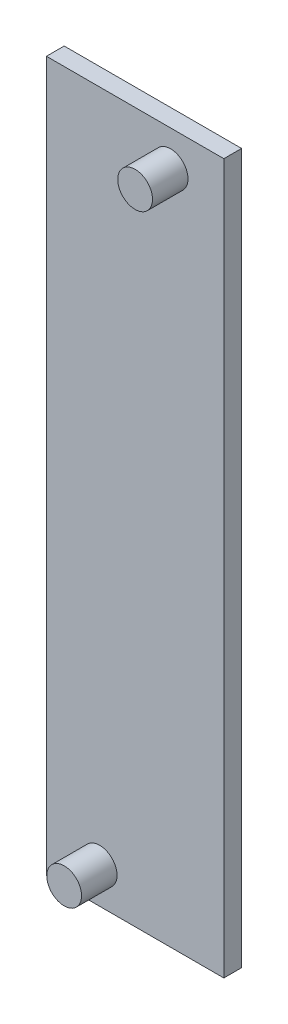
ISO-10303-21;
HEADER;
FILE_DESCRIPTION(('STEP AP214'),'2;1');
FILE_NAME('part.step','',(''),(''),'','','');
FILE_SCHEMA(('AUTOMOTIVE_DESIGN { 1 0 10303 214 1 1 1 1 }'));
ENDSEC;
DATA;
#1=APPLICATION_CONTEXT('core data for automotive mechanical design processes');
#2=APPLICATION_PROTOCOL_DEFINITION('international standard','automotive_design',2000,#1);
#3=PRODUCT_CONTEXT('',#1,'mechanical');
#4=PRODUCT('Part','Part','',(#3));
#5=PRODUCT_RELATED_PRODUCT_CATEGORY('part','',(#4));
#6=PRODUCT_DEFINITION_FORMATION('','',#4);
#7=PRODUCT_DEFINITION_CONTEXT('part definition',#1,'design');
#8=PRODUCT_DEFINITION('design','',#6,#7);
#9=PRODUCT_DEFINITION_SHAPE('','',#8);
#10=(LENGTH_UNIT() NAMED_UNIT(*) SI_UNIT(.MILLI.,.METRE.));
#11=(NAMED_UNIT(*) PLANE_ANGLE_UNIT() SI_UNIT($,.RADIAN.));
#12=(NAMED_UNIT(*) SI_UNIT($,.STERADIAN.) SOLID_ANGLE_UNIT());
#13=UNCERTAINTY_MEASURE_WITH_UNIT(LENGTH_MEASURE(1.E-05),#10,'distance_accuracy_value','');
#14=(GEOMETRIC_REPRESENTATION_CONTEXT(3) GLOBAL_UNCERTAINTY_ASSIGNED_CONTEXT((#13)) GLOBAL_UNIT_ASSIGNED_CONTEXT((#10,
#11,#12)) REPRESENTATION_CONTEXT('',''));
#15=CARTESIAN_POINT('',(0.,0.,0.));
#16=DIRECTION('',(0.,0.,1.));
#17=DIRECTION('',(1.,0.,0.));
#18=AXIS2_PLACEMENT_3D('',#15,#16,#17);
#19=CARTESIAN_POINT('',(0.,0.,5.));
#20=DIRECTION('',(1.,0.,0.));
#21=DIRECTION('',(0.,1.,0.));
#22=AXIS2_PLACEMENT_3D('',#19,#20,#21);
#23=PLANE('',#22);
#24=DIRECTION('',(0.,-1.,0.));
#25=VECTOR('',#24,1.);
#26=CARTESIAN_POINT('',(0.,0.,0.));
#27=LINE('',#26,#25);
#28=CARTESIAN_POINT('',(0.,200.,0.));
#29=VERTEX_POINT('',#28);
#30=CARTESIAN_POINT('',(0.,0.,0.));
#31=VERTEX_POINT('',#30);
#32=EDGE_CURVE('E99',#29,#31,#27,.T.);
#33=ORIENTED_EDGE('',*,*,#32,.T.);
#34=DIRECTION('',(0.,0.,-1.));
#35=VECTOR('',#34,1.);
#36=CARTESIAN_POINT('',(0.,0.,5.));
#37=LINE('',#36,#35);
#38=CARTESIAN_POINT('',(0.,0.,5.));
#39=VERTEX_POINT('',#38);
#40=EDGE_CURVE('E90',#39,#31,#37,.T.);
#41=ORIENTED_EDGE('',*,*,#40,.F.);
#42=DIRECTION('',(0.,-1.,0.));
#43=VECTOR('',#42,1.);
#44=CARTESIAN_POINT('',(0.,0.,5.));
#45=LINE('',#44,#43);
#46=CARTESIAN_POINT('',(0.,200.,5.));
#47=VERTEX_POINT('',#46);
#48=EDGE_CURVE('E84',#47,#39,#45,.T.);
#49=ORIENTED_EDGE('',*,*,#48,.F.);
#50=DIRECTION('',(0.,0.,-1.));
#51=VECTOR('',#50,1.);
#52=CARTESIAN_POINT('',(0.,200.,5.));
#53=LINE('',#52,#51);
#54=EDGE_CURVE('E95',#47,#29,#53,.T.);
#55=ORIENTED_EDGE('',*,*,#54,.T.);
#56=EDGE_LOOP('',(#33,#41,#49,#55));
#57=FACE_BOUND('',#56,.T.);
#58=ADVANCED_FACE('F32',(#57),#23,.F.);
#59=CARTESIAN_POINT('',(0.,0.,5.));
#60=DIRECTION('',(0.,1.,0.));
#61=DIRECTION('',(0.,0.,1.));
#62=AXIS2_PLACEMENT_3D('',#59,#60,#61);
#63=PLANE('',#62);
#64=DIRECTION('',(1.,0.,0.));
#65=VECTOR('',#64,1.);
#66=CARTESIAN_POINT('',(0.,0.,0.));
#67=LINE('',#66,#65);
#68=CARTESIAN_POINT('',(50.,0.,0.));
#69=VERTEX_POINT('',#68);
#70=EDGE_CURVE('E89',#31,#69,#67,.T.);
#71=ORIENTED_EDGE('',*,*,#70,.T.);
#72=DIRECTION('',(0.,0.,-1.));
#73=VECTOR('',#72,1.);
#74=CARTESIAN_POINT('',(50.,0.,5.));
#75=LINE('',#74,#73);
#76=CARTESIAN_POINT('',(50.,0.,5.));
#77=VERTEX_POINT('',#76);
#78=EDGE_CURVE('E87',#77,#69,#75,.T.);
#79=ORIENTED_EDGE('',*,*,#78,.F.);
#80=DIRECTION('',(1.,0.,0.));
#81=VECTOR('',#80,1.);
#82=CARTESIAN_POINT('',(0.,0.,5.));
#83=LINE('',#82,#81);
#84=EDGE_CURVE('E79',#39,#77,#83,.T.);
#85=ORIENTED_EDGE('',*,*,#84,.F.);
#86=ORIENTED_EDGE('',*,*,#40,.T.);
#87=EDGE_LOOP('',(#71,#79,#85,#86));
#88=FACE_BOUND('',#87,.T.);
#89=ADVANCED_FACE('F88',(#88),#63,.F.);
#90=CARTESIAN_POINT('',(50.,0.,5.));
#91=DIRECTION('',(-1.,0.,0.));
#92=DIRECTION('',(0.,-1.,0.));
#93=AXIS2_PLACEMENT_3D('',#90,#91,#92);
#94=PLANE('',#93);
#95=DIRECTION('',(0.,1.,0.));
#96=VECTOR('',#95,1.);
#97=CARTESIAN_POINT('',(50.,0.,0.));
#98=LINE('',#97,#96);
#99=CARTESIAN_POINT('',(50.,200.,0.));
#100=VERTEX_POINT('',#99);
#101=EDGE_CURVE('E65',#69,#100,#98,.T.);
#102=ORIENTED_EDGE('',*,*,#101,.T.);
#103=DIRECTION('',(0.,0.,-1.));
#104=VECTOR('',#103,1.);
#105=CARTESIAN_POINT('',(50.,200.,5.));
#106=LINE('',#105,#104);
#107=CARTESIAN_POINT('',(50.,200.,5.));
#108=VERTEX_POINT('',#107);
#109=EDGE_CURVE('E91',#108,#100,#106,.T.);
#110=ORIENTED_EDGE('',*,*,#109,.F.);
#111=DIRECTION('',(0.,1.,0.));
#112=VECTOR('',#111,1.);
#113=CARTESIAN_POINT('',(50.,0.,5.));
#114=LINE('',#113,#112);
#115=EDGE_CURVE('E82',#77,#108,#114,.T.);
#116=ORIENTED_EDGE('',*,*,#115,.F.);
#117=ORIENTED_EDGE('',*,*,#78,.T.);
#118=EDGE_LOOP('',(#102,#110,#116,#117));
#119=FACE_BOUND('',#118,.T.);
#120=ADVANCED_FACE('F93',(#119),#94,.F.);
#121=CARTESIAN_POINT('',(0.,200.,5.));
#122=DIRECTION('',(0.,-1.,0.));
#123=DIRECTION('',(0.,0.,-1.));
#124=AXIS2_PLACEMENT_3D('',#121,#122,#123);
#125=PLANE('',#124);
#126=DIRECTION('',(-1.,0.,0.));
#127=VECTOR('',#126,1.);
#128=CARTESIAN_POINT('',(0.,200.,0.));
#129=LINE('',#128,#127);
#130=EDGE_CURVE('E71',#100,#29,#129,.T.);
#131=ORIENTED_EDGE('',*,*,#130,.T.);
#132=ORIENTED_EDGE('',*,*,#54,.F.);
#133=DIRECTION('',(-1.,0.,0.));
#134=VECTOR('',#133,1.);
#135=CARTESIAN_POINT('',(0.,200.,5.));
#136=LINE('',#135,#134);
#137=EDGE_CURVE('E48',#108,#47,#136,.T.);
#138=ORIENTED_EDGE('',*,*,#137,.F.);
#139=ORIENTED_EDGE('',*,*,#109,.T.);
#140=EDGE_LOOP('',(#131,#132,#138,#139));
#141=FACE_BOUND('',#140,.T.);
#142=ADVANCED_FACE('F115',(#141),#125,.F.);
#143=CARTESIAN_POINT('',(0.,0.,5.));
#144=DIRECTION('',(0.,0.,-1.));
#145=DIRECTION('',(-1.,0.,0.));
#146=AXIS2_PLACEMENT_3D('',#143,#144,#145);
#147=PLANE('',#146);
#148=CARTESIAN_POINT('',(35.,190.,5.));
#149=DIRECTION('',(0.,0.,-1.));
#150=DIRECTION('',(-1.,0.,0.));
#151=AXIS2_PLACEMENT_3D('',#148,#149,#150);
#152=CIRCLE('',#151,4.89999999999998);
#153=CARTESIAN_POINT('',(30.1,190.,5.));
#154=VERTEX_POINT('',#153);
#155=EDGE_CURVE('E11',#154,#154,#152,.F.);
#156=ORIENTED_EDGE('',*,*,#155,.F.);
#157=EDGE_LOOP('',(#156));
#158=FACE_BOUND('',#157,.T.);
#159=CARTESIAN_POINT('',(15.,10.,5.));
#160=DIRECTION('',(0.,0.,-1.));
#161=DIRECTION('',(-1.,0.,0.));
#162=AXIS2_PLACEMENT_3D('',#159,#160,#161);
#163=CIRCLE('',#162,4.9);
#164=CARTESIAN_POINT('',(10.1,10.,5.));
#165=VERTEX_POINT('',#164);
#166=EDGE_CURVE('E40',#165,#165,#163,.F.);
#167=ORIENTED_EDGE('',*,*,#166,.F.);
#168=EDGE_LOOP('',(#167));
#169=FACE_BOUND('',#168,.T.);
#170=ORIENTED_EDGE('',*,*,#48,.T.);
#171=ORIENTED_EDGE('',*,*,#84,.T.);
#172=ORIENTED_EDGE('',*,*,#115,.T.);
#173=ORIENTED_EDGE('',*,*,#137,.T.);
#174=EDGE_LOOP('',(#170,#171,#172,#173));
#175=FACE_BOUND('',#174,.T.);
#176=ADVANCED_FACE('F80',(#158,#169,#175),#147,.F.);
#177=CARTESIAN_POINT('',(0.,0.,0.));
#178=DIRECTION('',(0.,0.,-1.));
#179=DIRECTION('',(-1.,0.,0.));
#180=AXIS2_PLACEMENT_3D('',#177,#178,#179);
#181=PLANE('',#180);
#182=ORIENTED_EDGE('',*,*,#32,.F.);
#183=ORIENTED_EDGE('',*,*,#130,.F.);
#184=ORIENTED_EDGE('',*,*,#101,.F.);
#185=ORIENTED_EDGE('',*,*,#70,.F.);
#186=EDGE_LOOP('',(#182,#183,#184,#185));
#187=FACE_BOUND('',#186,.T.);
#188=ADVANCED_FACE('F114',(#187),#181,.T.);
#189=CARTESIAN_POINT('',(15.,10.,15.));
#190=DIRECTION('',(0.,0.,-1.));
#191=DIRECTION('',(-1.,0.,0.));
#192=AXIS2_PLACEMENT_3D('',#189,#190,#191);
#193=CYLINDRICAL_SURFACE('',#192,4.9);
#194=CARTESIAN_POINT('',(15.,10.,15.));
#195=DIRECTION('',(0.,0.,1.));
#196=DIRECTION('',(1.,0.,0.));
#197=AXIS2_PLACEMENT_3D('',#194,#195,#196);
#198=CIRCLE('',#197,4.9);
#199=CARTESIAN_POINT('',(19.9,10.,15.));
#200=VERTEX_POINT('',#199);
#201=EDGE_CURVE('E102',#200,#200,#198,.T.);
#202=ORIENTED_EDGE('',*,*,#201,.F.);
#203=EDGE_LOOP('',(#202));
#204=FACE_BOUND('',#203,.T.);
#205=ORIENTED_EDGE('',*,*,#166,.T.);
#206=EDGE_LOOP('',(#205));
#207=FACE_BOUND('',#206,.T.);
#208=ADVANCED_FACE('F111',(#204,#207),#193,.T.);
#209=CARTESIAN_POINT('',(15.,10.,15.));
#210=DIRECTION('',(0.,0.,1.));
#211=DIRECTION('',(1.,0.,0.));
#212=AXIS2_PLACEMENT_3D('',#209,#210,#211);
#213=PLANE('',#212);
#214=ORIENTED_EDGE('',*,*,#201,.T.);
#215=EDGE_LOOP('',(#214));
#216=FACE_BOUND('',#215,.T.);
#217=ADVANCED_FACE('F145',(#216),#213,.T.);
#218=CARTESIAN_POINT('',(35.,190.,15.));
#219=DIRECTION('',(0.,0.,-1.));
#220=DIRECTION('',(-1.,0.,0.));
#221=AXIS2_PLACEMENT_3D('',#218,#219,#220);
#222=CYLINDRICAL_SURFACE('',#221,4.89999999999998);
#223=CARTESIAN_POINT('',(35.,190.,15.));
#224=DIRECTION('',(0.,0.,1.));
#225=DIRECTION('',(1.,0.,0.));
#226=AXIS2_PLACEMENT_3D('',#223,#224,#225);
#227=CIRCLE('',#226,4.89999999999998);
#228=CARTESIAN_POINT('',(39.8999999999999,190.,15.));
#229=VERTEX_POINT('',#228);
#230=EDGE_CURVE('E136',#229,#229,#227,.T.);
#231=ORIENTED_EDGE('',*,*,#230,.F.);
#232=EDGE_LOOP('',(#231));
#233=FACE_BOUND('',#232,.T.);
#234=ORIENTED_EDGE('',*,*,#155,.T.);
#235=EDGE_LOOP('',(#234));
#236=FACE_BOUND('',#235,.T.);
#237=ADVANCED_FACE('F142',(#233,#236),#222,.T.);
#238=CARTESIAN_POINT('',(35.,190.,15.));
#239=DIRECTION('',(0.,0.,1.));
#240=DIRECTION('',(1.,0.,0.));
#241=AXIS2_PLACEMENT_3D('',#238,#239,#240);
#242=PLANE('',#241);
#243=ORIENTED_EDGE('',*,*,#230,.T.);
#244=EDGE_LOOP('',(#243));
#245=FACE_BOUND('',#244,.T.);
#246=ADVANCED_FACE('F140',(#245),#242,.T.);
#247=CLOSED_SHELL('',(#58,#89,#120,#142,#176,#188,#208,#217,#237,#246));
#248=MANIFOLD_SOLID_BREP('B2',#247);
#249=ADVANCED_BREP_SHAPE_REPRESENTATION('',(#18,#248),#14);
#250=SHAPE_DEFINITION_REPRESENTATION(#9,#249);
ENDSEC;
END-ISO-10303-21;
